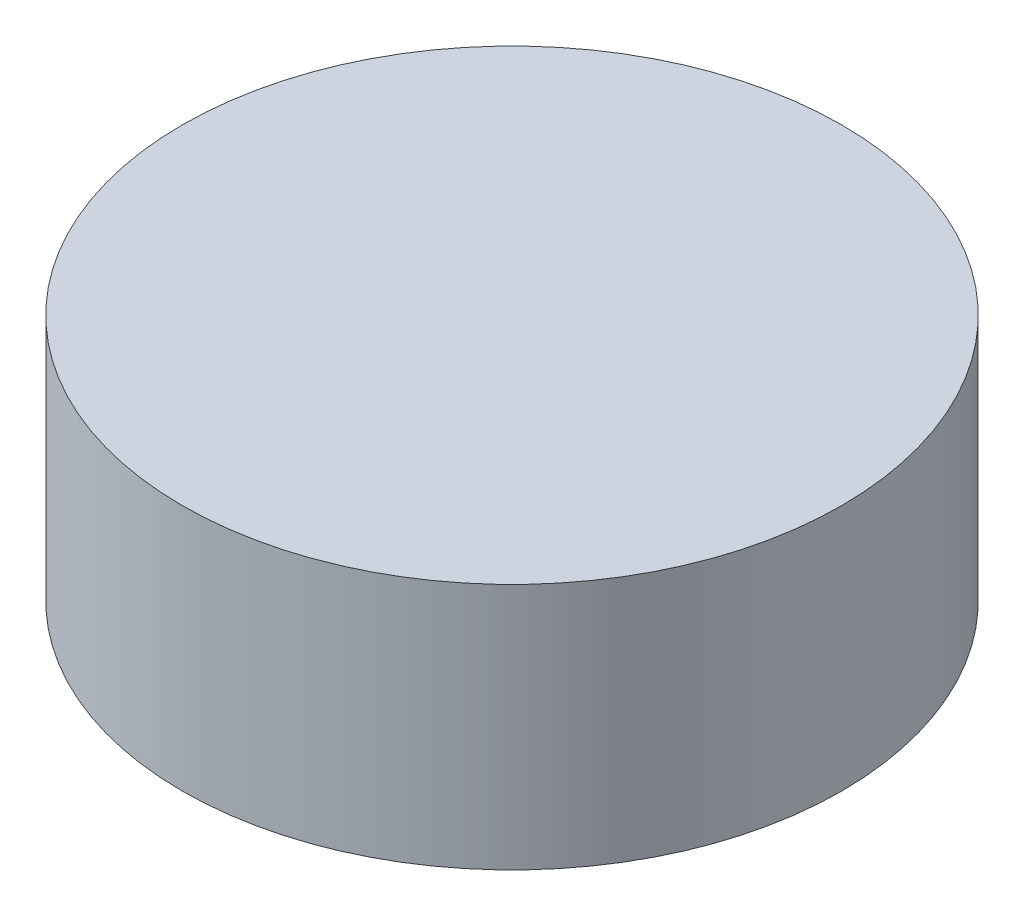
ISO-10303-21;
HEADER;
FILE_DESCRIPTION(('STEP AP214'),'2;1');
FILE_NAME('part.step','',(''),(''),'','','');
FILE_SCHEMA(('AUTOMOTIVE_DESIGN { 1 0 10303 214 1 1 1 1 }'));
ENDSEC;
DATA;
#1=APPLICATION_CONTEXT('core data for automotive mechanical design processes');
#2=APPLICATION_PROTOCOL_DEFINITION('international standard','automotive_design',2000,#1);
#3=PRODUCT_CONTEXT('',#1,'mechanical');
#4=PRODUCT('Part','Part','',(#3));
#5=PRODUCT_RELATED_PRODUCT_CATEGORY('part','',(#4));
#6=PRODUCT_DEFINITION_FORMATION('','',#4);
#7=PRODUCT_DEFINITION_CONTEXT('part definition',#1,'design');
#8=PRODUCT_DEFINITION('design','',#6,#7);
#9=PRODUCT_DEFINITION_SHAPE('','',#8);
#10=(LENGTH_UNIT() NAMED_UNIT(*) SI_UNIT(.MILLI.,.METRE.));
#11=(NAMED_UNIT(*) PLANE_ANGLE_UNIT() SI_UNIT($,.RADIAN.));
#12=(NAMED_UNIT(*) SI_UNIT($,.STERADIAN.) SOLID_ANGLE_UNIT());
#13=UNCERTAINTY_MEASURE_WITH_UNIT(LENGTH_MEASURE(1.E-05),#10,'distance_accuracy_value','');
#14=(GEOMETRIC_REPRESENTATION_CONTEXT(3) GLOBAL_UNCERTAINTY_ASSIGNED_CONTEXT((#13)) GLOBAL_UNIT_ASSIGNED_CONTEXT((#10,
#11,#12)) REPRESENTATION_CONTEXT('',''));
#15=CARTESIAN_POINT('',(0.,0.,0.));
#16=DIRECTION('',(0.,0.,1.));
#17=DIRECTION('',(1.,0.,0.));
#18=AXIS2_PLACEMENT_3D('',#15,#16,#17);
#19=CARTESIAN_POINT('',(0.,10.5,0.));
#20=DIRECTION('',(0.,1.,0.));
#21=DIRECTION('',(0.,0.,1.));
#22=AXIS2_PLACEMENT_3D('',#19,#20,#21);
#23=PLANE('',#22);
#24=CARTESIAN_POINT('',(0.,10.5,0.));
#25=DIRECTION('',(0.,1.,0.));
#26=DIRECTION('',(0.,0.,1.));
#27=AXIS2_PLACEMENT_3D('',#24,#25,#26);
#28=CIRCLE('',#27,3.5);
#29=CARTESIAN_POINT('',(-3.33536308297221,10.5,1.06082661389415));
#30=VERTEX_POINT('',#29);
#31=CARTESIAN_POINT('',(-0.751021188233193,10.5,-3.4184743928871));
#32=VERTEX_POINT('',#31);
#33=EDGE_CURVE('E11',#30,#32,#28,.F.);
#34=ORIENTED_EDGE('',*,*,#33,.F.);
#35=DIRECTION('',(-0.865876006893149,0.,0.500258673774653));
#36=VECTOR('',#35,1.);
#37=CARTESIAN_POINT('',(-0.375194005330973,10.5,-0.649407005169833));
#38=LINE('',#37,#36);
#39=CARTESIAN_POINT('',(-12.9135898481907,10.5,6.59463397261033));
#40=VERTEX_POINT('',#39);
#41=EDGE_CURVE('E178',#30,#40,#38,.T.);
#42=ORIENTED_EDGE('',*,*,#41,.T.);
#43=CARTESIAN_POINT('',(0.,10.5,0.));
#44=DIRECTION('',(0.,1.,0.));
#45=DIRECTION('',(0.,0.,1.));
#46=AXIS2_PLACEMENT_3D('',#43,#44,#45);
#47=CIRCLE('',#46,14.5);
#48=CARTESIAN_POINT('',(-0.754325557921085,10.5,-14.4803657741325));
#49=VERTEX_POINT('',#48);
#50=EDGE_CURVE('E218',#49,#40,#47,.T.);
#51=ORIENTED_EDGE('',*,*,#50,.F.);
#52=DIRECTION('',(-0.000298716505756613,0.,-0.999999955384224));
#53=VECTOR('',#52,1.);
#54=CARTESIAN_POINT('',(-0.749999966538305,10.5,0.0002240373793175));
#55=LINE('',#54,#53);
#56=EDGE_CURVE('E308',#32,#49,#55,.T.);
#57=ORIENTED_EDGE('',*,*,#56,.F.);
#58=EDGE_LOOP('',(#34,#42,#51,#57));
#59=FACE_BOUND('',#58,.T.);
#60=ADVANCED_FACE('F41',(#59),#23,.F.);
#61=CARTESIAN_POINT('',(0.,10.5,0.));
#62=DIRECTION('',(0.,-1.,0.));
#63=DIRECTION('',(0.,0.,-1.));
#64=AXIS2_PLACEMENT_3D('',#61,#62,#63);
#65=CIRCLE('',#64,3.5);
#66=CARTESIAN_POINT('',(0.748978744843143,10.5,-3.41892246764579));
#67=VERTEX_POINT('',#66);
#68=CARTESIAN_POINT('',(3.33599626054341,10.5,1.05883376865323));
#69=VERTEX_POINT('',#68);
#70=EDGE_CURVE('E293',#67,#69,#65,.T.);
#71=ORIENTED_EDGE('',*,*,#70,.F.);
#72=DIRECTION('',(-0.000298716505756614,0.,-0.999999955384224));
#73=VECTOR('',#72,1.);
#74=CARTESIAN_POINT('',(0.74999996653803,10.5,-0.000224037379317419));
#75=LINE('',#74,#73);
#76=CARTESIAN_POINT('',(0.745674375155251,10.5,-14.4808138488911));
#77=VERTEX_POINT('',#76);
#78=EDGE_CURVE('E311',#67,#77,#75,.T.);
#79=ORIENTED_EDGE('',*,*,#78,.T.);
#80=CARTESIAN_POINT('',(0.,10.5,0.));
#81=DIRECTION('',(0.,1.,0.));
#82=DIRECTION('',(0.,0.,1.));
#83=AXIS2_PLACEMENT_3D('',#80,#81,#82);
#84=CIRCLE('',#83,14.5);
#85=CARTESIAN_POINT('',(12.91752739545,10.5,6.5869177911827));
#86=VERTEX_POINT('',#85);
#87=EDGE_CURVE('E172',#86,#77,#84,.T.);
#88=ORIENTED_EDGE('',*,*,#87,.F.);
#89=DIRECTION('',(0.866174723398921,0.,0.499741281609597));
#90=VECTOR('',#89,1.);
#91=CARTESIAN_POINT('',(0.374805961207266,10.5,-0.64963104254931));
#92=LINE('',#91,#90);
#93=EDGE_CURVE('E168',#69,#86,#92,.T.);
#94=ORIENTED_EDGE('',*,*,#93,.F.);
#95=EDGE_LOOP('',(#71,#79,#88,#94));
#96=FACE_BOUND('',#95,.T.);
#97=ADVANCED_FACE('F323',(#96),#23,.F.);
#98=CARTESIAN_POINT('',(2.58638433812907,10.5,2.35809585375164));
#99=VERTEX_POINT('',#98);
#100=CARTESIAN_POINT('',(-2.58497507231021,10.5,2.35964062423387));
#101=VERTEX_POINT('',#100);
#102=EDGE_CURVE('E45',#99,#101,#28,.F.);
#103=ORIENTED_EDGE('',*,*,#102,.F.);
#104=DIRECTION('',(0.866174723398937,0.,0.49974128160957));
#105=VECTOR('',#104,1.);
#106=CARTESIAN_POINT('',(-0.374805961207161,10.5,0.649631042549174));
#107=LINE('',#106,#105);
#108=CARTESIAN_POINT('',(12.1679154730358,10.5,7.88617987628081));
#109=VERTEX_POINT('',#108);
#110=EDGE_CURVE('E145',#99,#109,#107,.T.);
#111=ORIENTED_EDGE('',*,*,#110,.T.);
#112=CARTESIAN_POINT('',(0.,10.5,0.));
#113=DIRECTION('',(0.,1.,0.));
#114=DIRECTION('',(0.,0.,1.));
#115=AXIS2_PLACEMENT_3D('',#112,#113,#114);
#116=CIRCLE('',#115,14.5);
#117=CARTESIAN_POINT('',(-12.1632018375289,10.5,7.89344798294977));
#118=VERTEX_POINT('',#117);
#119=EDGE_CURVE('E157',#118,#109,#116,.T.);
#120=ORIENTED_EDGE('',*,*,#119,.F.);
#121=DIRECTION('',(-0.865876006893164,0.,0.500258673774627));
#122=VECTOR('',#121,1.);
#123=CARTESIAN_POINT('',(0.375194005331039,10.5,0.649407005169993));
#124=LINE('',#123,#122);
#125=EDGE_CURVE('E163',#101,#118,#124,.T.);
#126=ORIENTED_EDGE('',*,*,#125,.F.);
#127=EDGE_LOOP('',(#103,#111,#120,#126));
#128=FACE_BOUND('',#127,.T.);
#129=ADVANCED_FACE('F165',(#128),#23,.F.);
#130=CARTESIAN_POINT('',(0.,10.5,0.));
#131=DIRECTION('',(0.,-1.,0.));
#132=DIRECTION('',(0.,0.,-1.));
#133=AXIS2_PLACEMENT_3D('',#130,#131,#132);
#134=CYLINDRICAL_SURFACE('',#133,14.5);
#135=CARTESIAN_POINT('',(0.,0.,0.));
#136=DIRECTION('',(0.,1.,0.));
#137=DIRECTION('',(0.,0.,1.));
#138=AXIS2_PLACEMENT_3D('',#135,#136,#137);
#139=CIRCLE('',#138,14.5);
#140=CARTESIAN_POINT('',(-0.754325557921085,0.,-14.4803657741325));
#141=VERTEX_POINT('',#140);
#142=CARTESIAN_POINT('',(-12.9135898481907,0.,6.59463397261033));
#143=VERTEX_POINT('',#142);
#144=EDGE_CURVE('E181',#141,#143,#139,.T.);
#145=ORIENTED_EDGE('',*,*,#144,.F.);
#146=DIRECTION('',(0.,-1.,0.));
#147=VECTOR('',#146,1.);
#148=CARTESIAN_POINT('',(-0.754325557921085,10.5,-14.4803657741325));
#149=LINE('',#148,#147);
#150=EDGE_CURVE('E116',#49,#141,#149,.T.);
#151=ORIENTED_EDGE('',*,*,#150,.F.);
#152=ORIENTED_EDGE('',*,*,#50,.T.);
#153=DIRECTION('',(0.,-1.,0.));
#154=VECTOR('',#153,1.);
#155=CARTESIAN_POINT('',(-12.9135898481907,10.5,6.59463397261033));
#156=LINE('',#155,#154);
#157=EDGE_CURVE('E111',#40,#143,#156,.T.);
#158=ORIENTED_EDGE('',*,*,#157,.T.);
#159=EDGE_LOOP('',(#145,#151,#152,#158));
#160=FACE_BOUND('',#159,.T.);
#161=ADVANCED_FACE('F43',(#160),#134,.F.);
#162=CARTESIAN_POINT('',(-0.749999966538305,10.5,0.0002240373793175));
#163=DIRECTION('',(-0.999999955384224,0.,0.000298716505756612));
#164=DIRECTION('',(0.000298716505756612,0.,0.999999955384224));
#165=AXIS2_PLACEMENT_3D('',#162,#163,#164);
#166=PLANE('',#165);
#167=DIRECTION('',(-0.000298716505756613,0.,-0.999999955384224));
#168=VECTOR('',#167,1.);
#169=CARTESIAN_POINT('',(-0.749999966538305,0.,0.0002240373793175));
#170=LINE('',#169,#168);
#171=CARTESIAN_POINT('',(-0.751021188233193,0.,-3.4184743928871));
#172=VERTEX_POINT('',#171);
#173=EDGE_CURVE('E185',#172,#141,#170,.T.);
#174=ORIENTED_EDGE('',*,*,#173,.F.);
#175=DIRECTION('',(0.,-1.,0.));
#176=VECTOR('',#175,1.);
#177=CARTESIAN_POINT('',(-0.751021188233193,10.5,-3.4184743928871));
#178=LINE('',#177,#176);
#179=EDGE_CURVE('E245',#32,#172,#178,.T.);
#180=ORIENTED_EDGE('',*,*,#179,.F.);
#181=ORIENTED_EDGE('',*,*,#56,.T.);
#182=ORIENTED_EDGE('',*,*,#150,.T.);
#183=EDGE_LOOP('',(#174,#180,#181,#182));
#184=FACE_BOUND('',#183,.T.);
#185=ADVANCED_FACE('F361',(#184),#166,.T.);
#186=CARTESIAN_POINT('',(0.74999996653803,10.5,-0.000224037379317419));
#187=DIRECTION('',(-0.999999955384224,0.,0.000298716505756614));
#188=DIRECTION('',(0.000298716505756614,0.,0.999999955384224));
#189=AXIS2_PLACEMENT_3D('',#186,#187,#188);
#190=PLANE('',#189);
#191=DIRECTION('',(-0.000298716505756614,0.,-0.999999955384224));
#192=VECTOR('',#191,1.);
#193=CARTESIAN_POINT('',(0.74999996653803,0.,-0.000224037379317419));
#194=LINE('',#193,#192);
#195=CARTESIAN_POINT('',(0.748978744843143,0.,-3.41892246764579));
#196=VERTEX_POINT('',#195);
#197=CARTESIAN_POINT('',(0.745674375155251,0.,-14.4808138488911));
#198=VERTEX_POINT('',#197);
#199=EDGE_CURVE('E190',#196,#198,#194,.T.);
#200=ORIENTED_EDGE('',*,*,#199,.T.);
#201=DIRECTION('',(0.,-1.,0.));
#202=VECTOR('',#201,1.);
#203=CARTESIAN_POINT('',(0.745674375155251,10.5,-14.4808138488911));
#204=LINE('',#203,#202);
#205=EDGE_CURVE('E239',#77,#198,#204,.T.);
#206=ORIENTED_EDGE('',*,*,#205,.F.);
#207=ORIENTED_EDGE('',*,*,#78,.F.);
#208=DIRECTION('',(0.,-1.,0.));
#209=VECTOR('',#208,1.);
#210=CARTESIAN_POINT('',(0.748978744843143,10.5,-3.41892246764579));
#211=LINE('',#210,#209);
#212=EDGE_CURVE('E242',#67,#196,#211,.T.);
#213=ORIENTED_EDGE('',*,*,#212,.T.);
#214=EDGE_LOOP('',(#200,#206,#207,#213));
#215=FACE_BOUND('',#214,.T.);
#216=ADVANCED_FACE('F326',(#215),#190,.F.);
#217=CARTESIAN_POINT('',(0.,10.5,0.));
#218=DIRECTION('',(0.,-1.,0.));
#219=DIRECTION('',(0.,0.,-1.));
#220=AXIS2_PLACEMENT_3D('',#217,#218,#219);
#221=CYLINDRICAL_SURFACE('',#220,14.5);
#222=CARTESIAN_POINT('',(0.,0.,0.));
#223=DIRECTION('',(0.,1.,0.));
#224=DIRECTION('',(0.,0.,1.));
#225=AXIS2_PLACEMENT_3D('',#222,#223,#224);
#226=CIRCLE('',#225,14.5);
#227=CARTESIAN_POINT('',(12.91752739545,0.,6.5869177911827));
#228=VERTEX_POINT('',#227);
#229=EDGE_CURVE('E194',#228,#198,#226,.T.);
#230=ORIENTED_EDGE('',*,*,#229,.F.);
#231=DIRECTION('',(0.,-1.,0.));
#232=VECTOR('',#231,1.);
#233=CARTESIAN_POINT('',(12.91752739545,10.5,6.5869177911827));
#234=LINE('',#233,#232);
#235=EDGE_CURVE('E236',#86,#228,#234,.T.);
#236=ORIENTED_EDGE('',*,*,#235,.F.);
#237=ORIENTED_EDGE('',*,*,#87,.T.);
#238=ORIENTED_EDGE('',*,*,#205,.T.);
#239=EDGE_LOOP('',(#230,#236,#237,#238));
#240=FACE_BOUND('',#239,.T.);
#241=ADVANCED_FACE('F319',(#240),#221,.F.);
#242=CARTESIAN_POINT('',(0.374805961207266,10.5,-0.64963104254931));
#243=DIRECTION('',(0.499741281609597,0.,-0.866174723398921));
#244=DIRECTION('',(-0.866174723398921,0.,-0.499741281609597));
#245=AXIS2_PLACEMENT_3D('',#242,#243,#244);
#246=PLANE('',#245);
#247=DIRECTION('',(0.866174723398921,0.,0.499741281609597));
#248=VECTOR('',#247,1.);
#249=CARTESIAN_POINT('',(0.374805961207266,0.,-0.64963104254931));
#250=LINE('',#249,#248);
#251=CARTESIAN_POINT('',(3.33599626054341,0.,1.05883376865323));
#252=VERTEX_POINT('',#251);
#253=EDGE_CURVE('E198',#252,#228,#250,.T.);
#254=ORIENTED_EDGE('',*,*,#253,.F.);
#255=DIRECTION('',(0.,-1.,0.));
#256=VECTOR('',#255,1.);
#257=CARTESIAN_POINT('',(3.33599626054341,10.5,1.05883376865323));
#258=LINE('',#257,#256);
#259=EDGE_CURVE('E232',#69,#252,#258,.T.);
#260=ORIENTED_EDGE('',*,*,#259,.F.);
#261=ORIENTED_EDGE('',*,*,#93,.T.);
#262=ORIENTED_EDGE('',*,*,#235,.T.);
#263=EDGE_LOOP('',(#254,#260,#261,#262));
#264=FACE_BOUND('',#263,.T.);
#265=ADVANCED_FACE('F334',(#264),#246,.T.);
#266=CARTESIAN_POINT('',(-0.374805961207161,10.5,0.649631042549174));
#267=DIRECTION('',(0.49974128160957,0.,-0.866174723398937));
#268=DIRECTION('',(-0.866174723398937,0.,-0.49974128160957));
#269=AXIS2_PLACEMENT_3D('',#266,#267,#268);
#270=PLANE('',#269);
#271=DIRECTION('',(0.866174723398937,0.,0.49974128160957));
#272=VECTOR('',#271,1.);
#273=CARTESIAN_POINT('',(-0.374805961207161,0.,0.649631042549174));
#274=LINE('',#273,#272);
#275=CARTESIAN_POINT('',(2.58638433812907,0.,2.35809585375164));
#276=VERTEX_POINT('',#275);
#277=CARTESIAN_POINT('',(12.1679154730358,0.,7.88617987628081));
#278=VERTEX_POINT('',#277);
#279=EDGE_CURVE('E148',#276,#278,#274,.T.);
#280=ORIENTED_EDGE('',*,*,#279,.T.);
#281=DIRECTION('',(0.,-1.,0.));
#282=VECTOR('',#281,1.);
#283=CARTESIAN_POINT('',(12.1679154730358,10.5,7.88617987628081));
#284=LINE('',#283,#282);
#285=EDGE_CURVE('E141',#109,#278,#284,.T.);
#286=ORIENTED_EDGE('',*,*,#285,.F.);
#287=ORIENTED_EDGE('',*,*,#110,.F.);
#288=DIRECTION('',(0.,-1.,0.));
#289=VECTOR('',#288,1.);
#290=CARTESIAN_POINT('',(2.58638433812907,10.5,2.35809585375164));
#291=LINE('',#290,#289);
#292=EDGE_CURVE('E153',#99,#276,#291,.T.);
#293=ORIENTED_EDGE('',*,*,#292,.T.);
#294=EDGE_LOOP('',(#280,#286,#287,#293));
#295=FACE_BOUND('',#294,.T.);
#296=ADVANCED_FACE('F143',(#295),#270,.F.);
#297=CARTESIAN_POINT('',(0.,10.5,0.));
#298=DIRECTION('',(0.,-1.,0.));
#299=DIRECTION('',(0.,0.,-1.));
#300=AXIS2_PLACEMENT_3D('',#297,#298,#299);
#301=CYLINDRICAL_SURFACE('',#300,14.5);
#302=CARTESIAN_POINT('',(0.,0.,0.));
#303=DIRECTION('',(0.,1.,0.));
#304=DIRECTION('',(0.,0.,1.));
#305=AXIS2_PLACEMENT_3D('',#302,#303,#304);
#306=CIRCLE('',#305,14.5);
#307=CARTESIAN_POINT('',(-12.1632018375289,0.,7.89344798294977));
#308=VERTEX_POINT('',#307);
#309=EDGE_CURVE('E204',#308,#278,#306,.T.);
#310=ORIENTED_EDGE('',*,*,#309,.F.);
#311=DIRECTION('',(0.,-1.,0.));
#312=VECTOR('',#311,1.);
#313=CARTESIAN_POINT('',(-12.1632018375289,10.5,7.89344798294977));
#314=LINE('',#313,#312);
#315=EDGE_CURVE('E154',#118,#308,#314,.T.);
#316=ORIENTED_EDGE('',*,*,#315,.F.);
#317=ORIENTED_EDGE('',*,*,#119,.T.);
#318=ORIENTED_EDGE('',*,*,#285,.T.);
#319=EDGE_LOOP('',(#310,#316,#317,#318));
#320=FACE_BOUND('',#319,.T.);
#321=ADVANCED_FACE('F158',(#320),#301,.F.);
#322=CARTESIAN_POINT('',(0.375194005331039,10.5,0.649407005169993));
#323=DIRECTION('',(0.500258673774627,0.,0.865876006893164));
#324=DIRECTION('',(0.865876006893164,0.,-0.500258673774627));
#325=AXIS2_PLACEMENT_3D('',#322,#323,#324);
#326=PLANE('',#325);
#327=DIRECTION('',(-0.865876006893164,0.,0.500258673774627));
#328=VECTOR('',#327,1.);
#329=CARTESIAN_POINT('',(0.375194005331039,0.,0.649407005169993));
#330=LINE('',#329,#328);
#331=CARTESIAN_POINT('',(-2.58497507231021,0.,2.35964062423387));
#332=VERTEX_POINT('',#331);
#333=EDGE_CURVE('E207',#332,#308,#330,.T.);
#334=ORIENTED_EDGE('',*,*,#333,.F.);
#335=DIRECTION('',(0.,-1.,0.));
#336=VECTOR('',#335,1.);
#337=CARTESIAN_POINT('',(-2.58497507231021,10.5,2.35964062423387));
#338=LINE('',#337,#336);
#339=EDGE_CURVE('E224',#101,#332,#338,.T.);
#340=ORIENTED_EDGE('',*,*,#339,.F.);
#341=ORIENTED_EDGE('',*,*,#125,.T.);
#342=ORIENTED_EDGE('',*,*,#315,.T.);
#343=EDGE_LOOP('',(#334,#340,#341,#342));
#344=FACE_BOUND('',#343,.T.);
#345=ADVANCED_FACE('F377',(#344),#326,.T.);
#346=CARTESIAN_POINT('',(-0.375194005330973,10.5,-0.649407005169833));
#347=DIRECTION('',(0.500258673774653,0.,0.865876006893149));
#348=DIRECTION('',(0.865876006893149,0.,-0.500258673774653));
#349=AXIS2_PLACEMENT_3D('',#346,#347,#348);
#350=PLANE('',#349);
#351=DIRECTION('',(-0.865876006893149,0.,0.500258673774653));
#352=VECTOR('',#351,1.);
#353=CARTESIAN_POINT('',(-0.375194005330973,0.,-0.649407005169833));
#354=LINE('',#353,#352);
#355=CARTESIAN_POINT('',(-3.33536308297221,0.,1.06082661389415));
#356=VERTEX_POINT('',#355);
#357=EDGE_CURVE('E211',#356,#143,#354,.T.);
#358=ORIENTED_EDGE('',*,*,#357,.T.);
#359=ORIENTED_EDGE('',*,*,#157,.F.);
#360=ORIENTED_EDGE('',*,*,#41,.F.);
#361=DIRECTION('',(0.,-1.,0.));
#362=VECTOR('',#361,1.);
#363=CARTESIAN_POINT('',(-3.33536308297221,10.5,1.06082661389415));
#364=LINE('',#363,#362);
#365=EDGE_CURVE('E221',#30,#356,#364,.T.);
#366=ORIENTED_EDGE('',*,*,#365,.T.);
#367=EDGE_LOOP('',(#358,#359,#360,#366));
#368=FACE_BOUND('',#367,.T.);
#369=ADVANCED_FACE('F373',(#368),#350,.F.);
#370=CARTESIAN_POINT('',(0.,10.5,0.));
#371=DIRECTION('',(0.,-1.,0.));
#372=DIRECTION('',(0.,0.,-1.));
#373=AXIS2_PLACEMENT_3D('',#370,#371,#372);
#374=CYLINDRICAL_SURFACE('',#373,16.);
#375=CARTESIAN_POINT('',(0.,0.,0.));
#376=DIRECTION('',(0.,1.,0.));
#377=DIRECTION('',(0.,0.,1.));
#378=AXIS2_PLACEMENT_3D('',#375,#376,#377);
#379=CIRCLE('',#378,16.);
#380=CARTESIAN_POINT('',(0.,0.,-16.));
#381=VERTEX_POINT('',#380);
#382=EDGE_CURVE('E214',#381,#381,#379,.T.);
#383=CARTESIAN_POINT('',(0.,12.,0.));
#384=DIRECTION('',(0.,1.,0.));
#385=DIRECTION('',(0.,0.,1.));
#386=AXIS2_PLACEMENT_3D('',#383,#384,#385);
#387=CIRCLE('',#386,16.);
#388=CARTESIAN_POINT('',(0.,12.,-16.));
#389=VERTEX_POINT('',#388);
#390=EDGE_CURVE('E186',#389,#389,#387,.T.);
#391=CARTESIAN_POINT('',(0.,0.,-16.));
#392=CARTESIAN_POINT('',(0.,0.125,-16.));
#393=CARTESIAN_POINT('',(0.,0.25,-16.));
#394=CARTESIAN_POINT('',(0.,0.5,-16.));
#395=CARTESIAN_POINT('',(0.,0.625000000000001,-16.));
#396=CARTESIAN_POINT('',(0.,0.875000000000001,-16.));
#397=CARTESIAN_POINT('',(0.,1.,-16.));
#398=CARTESIAN_POINT('',(0.,1.25,-16.));
#399=CARTESIAN_POINT('',(0.,1.375,-16.));
#400=CARTESIAN_POINT('',(0.,1.625,-16.));
#401=CARTESIAN_POINT('',(0.,1.75,-16.));
#402=CARTESIAN_POINT('',(0.,2.,-16.));
#403=CARTESIAN_POINT('',(0.,2.125,-16.));
#404=CARTESIAN_POINT('',(0.,2.375,-16.));
#405=CARTESIAN_POINT('',(0.,2.5,-16.));
#406=CARTESIAN_POINT('',(0.,2.75,-16.));
#407=CARTESIAN_POINT('',(0.,2.875,-16.));
#408=CARTESIAN_POINT('',(0.,3.125,-16.));
#409=CARTESIAN_POINT('',(0.,3.25,-16.));
#410=CARTESIAN_POINT('',(0.,3.5,-16.));
#411=CARTESIAN_POINT('',(0.,3.625,-16.));
#412=CARTESIAN_POINT('',(0.,3.875,-16.));
#413=CARTESIAN_POINT('',(0.,4.,-16.));
#414=CARTESIAN_POINT('',(0.,4.25,-16.));
#415=CARTESIAN_POINT('',(0.,4.375,-16.));
#416=CARTESIAN_POINT('',(0.,4.625,-16.));
#417=CARTESIAN_POINT('',(0.,4.75,-16.));
#418=CARTESIAN_POINT('',(0.,5.,-16.));
#419=CARTESIAN_POINT('',(0.,5.125,-16.));
#420=CARTESIAN_POINT('',(0.,5.375,-16.));
#421=CARTESIAN_POINT('',(0.,5.5,-16.));
#422=CARTESIAN_POINT('',(0.,5.75,-16.));
#423=CARTESIAN_POINT('',(0.,5.875,-16.));
#424=CARTESIAN_POINT('',(0.,6.125,-16.));
#425=CARTESIAN_POINT('',(0.,6.25,-16.));
#426=CARTESIAN_POINT('',(0.,6.5,-16.));
#427=CARTESIAN_POINT('',(0.,6.625,-16.));
#428=CARTESIAN_POINT('',(0.,6.875,-16.));
#429=CARTESIAN_POINT('',(0.,7.,-16.));
#430=CARTESIAN_POINT('',(0.,7.25,-16.));
#431=CARTESIAN_POINT('',(0.,7.375,-16.));
#432=CARTESIAN_POINT('',(0.,7.625,-16.));
#433=CARTESIAN_POINT('',(0.,7.75,-16.));
#434=CARTESIAN_POINT('',(0.,8.,-16.));
#435=CARTESIAN_POINT('',(0.,8.125,-16.));
#436=CARTESIAN_POINT('',(0.,8.375,-16.));
#437=CARTESIAN_POINT('',(0.,8.5,-16.));
#438=CARTESIAN_POINT('',(0.,8.75,-16.));
#439=CARTESIAN_POINT('',(0.,8.875,-16.));
#440=CARTESIAN_POINT('',(0.,9.125,-16.));
#441=CARTESIAN_POINT('',(0.,9.25,-16.));
#442=CARTESIAN_POINT('',(0.,9.5,-16.));
#443=CARTESIAN_POINT('',(0.,9.625,-16.));
#444=CARTESIAN_POINT('',(0.,9.875,-16.));
#445=CARTESIAN_POINT('',(0.,10.,-16.));
#446=CARTESIAN_POINT('',(0.,10.25,-16.));
#447=CARTESIAN_POINT('',(0.,10.375,-16.));
#448=CARTESIAN_POINT('',(0.,10.625,-16.));
#449=CARTESIAN_POINT('',(0.,10.75,-16.));
#450=CARTESIAN_POINT('',(0.,11.,-16.));
#451=CARTESIAN_POINT('',(0.,11.125,-16.));
#452=CARTESIAN_POINT('',(0.,11.375,-16.));
#453=CARTESIAN_POINT('',(0.,11.5,-16.));
#454=CARTESIAN_POINT('',(0.,11.75,-16.));
#455=CARTESIAN_POINT('',(0.,11.875,-16.));
#456=CARTESIAN_POINT('',(0.,12.,-16.));
#457=B_SPLINE_CURVE_WITH_KNOTS('',3,(#391,#392,#393,#394,#395,#396,#397,#398,#399,#400,#401,
#402,#403,#404,#405,#406,#407,#408,#409,#410,#411,#412,#413,#414,#415,#416,#417,#418,#419,#420,
#421,#422,#423,#424,#425,#426,#427,#428,#429,#430,#431,#432,#433,#434,#435,#436,#437,#438,#439,
#440,#441,#442,#443,#444,#445,#446,#447,#448,#449,#450,#451,#452,#453,#454,#455,#456),
.UNSPECIFIED.,.F.,.F.,(4,2,2,2,2,2,2,2,2,2,2,2,2,2,2,2,2,2,2,2,2,2,2,2,2,2,2,2,2,2,2,2,4),(0.,
0.375,0.750000000000001,1.125,1.5,1.875,2.25,2.625,3.,3.375,3.75,4.125,4.5,4.875,5.25,5.625,6.,
6.375,6.75,7.125,7.5,7.875,8.25,8.625,9.,9.375,9.75,10.125,10.5,10.875,11.25,11.625,12.),.UNSPECIFIED.);
#458=EDGE_CURVE('BSEAM376',#381,#389,#457,.T.);
#459=ORIENTED_EDGE('',*,*,#382,.T.);
#460=ORIENTED_EDGE('',*,*,#390,.F.);
#461=ORIENTED_EDGE('',*,*,#458,.T.);
#462=ORIENTED_EDGE('',*,*,#458,.F.);
#463=EDGE_LOOP('',(#459,#461,#460,#462));
#464=FACE_BOUND('',#463,.T.);
#465=ADVANCED_FACE('F376',(#464),#374,.T.);
#466=CARTESIAN_POINT('',(0.,0.,0.));
#467=DIRECTION('',(0.,1.,0.));
#468=DIRECTION('',(0.,0.,1.));
#469=AXIS2_PLACEMENT_3D('',#466,#467,#468);
#470=PLANE('',#469);
#471=CARTESIAN_POINT('',(0.,0.,0.));
#472=DIRECTION('',(0.,-1.,0.));
#473=DIRECTION('',(0.,0.,-1.));
#474=AXIS2_PLACEMENT_3D('',#471,#472,#473);
#475=CIRCLE('',#474,3.5);
#476=EDGE_CURVE('E298',#276,#332,#475,.T.);
#477=ORIENTED_EDGE('',*,*,#476,.T.);
#478=ORIENTED_EDGE('',*,*,#333,.T.);
#479=ORIENTED_EDGE('',*,*,#309,.T.);
#480=ORIENTED_EDGE('',*,*,#279,.F.);
#481=EDGE_LOOP('',(#477,#478,#479,#480));
#482=FACE_BOUND('',#481,.T.);
#483=EDGE_CURVE('E299',#356,#172,#475,.T.);
#484=ORIENTED_EDGE('',*,*,#483,.T.);
#485=ORIENTED_EDGE('',*,*,#173,.T.);
#486=ORIENTED_EDGE('',*,*,#144,.T.);
#487=ORIENTED_EDGE('',*,*,#357,.F.);
#488=EDGE_LOOP('',(#484,#485,#486,#487));
#489=FACE_BOUND('',#488,.T.);
#490=ORIENTED_EDGE('',*,*,#199,.F.);
#491=EDGE_CURVE('E294',#196,#252,#475,.T.);
#492=ORIENTED_EDGE('',*,*,#491,.T.);
#493=ORIENTED_EDGE('',*,*,#253,.T.);
#494=ORIENTED_EDGE('',*,*,#229,.T.);
#495=EDGE_LOOP('',(#490,#492,#493,#494));
#496=FACE_BOUND('',#495,.T.);
#497=ORIENTED_EDGE('',*,*,#382,.F.);
#498=EDGE_LOOP('',(#497));
#499=FACE_BOUND('',#498,.T.);
#500=DIRECTION('',(1.,0.,0.));
#501=VECTOR('',#500,1.);
#502=CARTESIAN_POINT('',(-2.59807621135332,0.,-1.5));
#503=LINE('',#502,#501);
#504=CARTESIAN_POINT('',(-2.59807621135332,0.,-1.5));
#505=VERTEX_POINT('',#504);
#506=CARTESIAN_POINT('',(2.59807621135332,0.,-1.5));
#507=VERTEX_POINT('',#506);
#508=EDGE_CURVE('E265',#505,#507,#503,.T.);
#509=ORIENTED_EDGE('',*,*,#508,.F.);
#510=CARTESIAN_POINT('',(0.,0.,0.));
#511=DIRECTION('',(0.,-1.,0.));
#512=DIRECTION('',(0.,0.,-1.));
#513=AXIS2_PLACEMENT_3D('',#510,#511,#512);
#514=CIRCLE('',#513,3.);
#515=EDGE_CURVE('E273',#507,#505,#514,.T.);
#516=ORIENTED_EDGE('',*,*,#515,.F.);
#517=EDGE_LOOP('',(#509,#516));
#518=FACE_BOUND('',#517,.T.);
#519=ADVANCED_FACE('F282',(#482,#489,#496,#499,#518),#470,.F.);
#520=CARTESIAN_POINT('',(0.,12.,0.));
#521=DIRECTION('',(0.,1.,0.));
#522=DIRECTION('',(0.,0.,1.));
#523=AXIS2_PLACEMENT_3D('',#520,#521,#522);
#524=PLANE('',#523);
#525=ORIENTED_EDGE('',*,*,#390,.T.);
#526=EDGE_LOOP('',(#525));
#527=FACE_BOUND('',#526,.T.);
#528=ADVANCED_FACE('F415',(#527),#524,.T.);
#529=CARTESIAN_POINT('',(0.,0.,0.));
#530=DIRECTION('',(0.,1.,0.));
#531=DIRECTION('',(0.,0.,1.));
#532=AXIS2_PLACEMENT_3D('',#529,#530,#531);
#533=CYLINDRICAL_SURFACE('',#532,3.5);
#534=ORIENTED_EDGE('',*,*,#491,.F.);
#535=ORIENTED_EDGE('',*,*,#212,.F.);
#536=ORIENTED_EDGE('',*,*,#70,.T.);
#537=ORIENTED_EDGE('',*,*,#259,.T.);
#538=EDGE_LOOP('',(#534,#535,#536,#537));
#539=FACE_BOUND('',#538,.T.);
#540=ADVANCED_FACE('F330',(#539),#533,.T.);
#541=ORIENTED_EDGE('',*,*,#476,.F.);
#542=ORIENTED_EDGE('',*,*,#292,.F.);
#543=ORIENTED_EDGE('',*,*,#102,.T.);
#544=ORIENTED_EDGE('',*,*,#339,.T.);
#545=EDGE_LOOP('',(#541,#542,#543,#544));
#546=FACE_BOUND('',#545,.T.);
#547=ADVANCED_FACE('F254',(#546),#533,.T.);
#548=ORIENTED_EDGE('',*,*,#179,.T.);
#549=ORIENTED_EDGE('',*,*,#483,.F.);
#550=ORIENTED_EDGE('',*,*,#365,.F.);
#551=ORIENTED_EDGE('',*,*,#33,.T.);
#552=EDGE_LOOP('',(#548,#549,#550,#551));
#553=FACE_BOUND('',#552,.T.);
#554=ADVANCED_FACE('F370',(#553),#533,.T.);
#555=CARTESIAN_POINT('',(0.,0.,0.));
#556=DIRECTION('',(0.,1.,0.));
#557=DIRECTION('',(0.,0.,1.));
#558=AXIS2_PLACEMENT_3D('',#555,#556,#557);
#559=CYLINDRICAL_SURFACE('',#558,3.);
#560=CARTESIAN_POINT('',(0.,10.5,0.));
#561=DIRECTION('',(0.,-1.,0.));
#562=DIRECTION('',(0.,0.,-1.));
#563=AXIS2_PLACEMENT_3D('',#560,#561,#562);
#564=CIRCLE('',#563,3.);
#565=CARTESIAN_POINT('',(2.59807621135332,10.5,-1.5));
#566=VERTEX_POINT('',#565);
#567=CARTESIAN_POINT('',(-2.59807621135332,10.5,-1.5));
#568=VERTEX_POINT('',#567);
#569=EDGE_CURVE('E278',#566,#568,#564,.T.);
#570=ORIENTED_EDGE('',*,*,#569,.F.);
#571=DIRECTION('',(0.,1.,0.));
#572=VECTOR('',#571,1.);
#573=CARTESIAN_POINT('',(2.59807621135332,0.,-1.5));
#574=LINE('',#573,#572);
#575=EDGE_CURVE('E57',#507,#566,#574,.T.);
#576=ORIENTED_EDGE('',*,*,#575,.F.);
#577=ORIENTED_EDGE('',*,*,#515,.T.);
#578=DIRECTION('',(0.,1.,0.));
#579=VECTOR('',#578,1.);
#580=CARTESIAN_POINT('',(-2.59807621135332,0.,-1.5));
#581=LINE('',#580,#579);
#582=EDGE_CURVE('E268',#505,#568,#581,.T.);
#583=ORIENTED_EDGE('',*,*,#582,.T.);
#584=EDGE_LOOP('',(#570,#576,#577,#583));
#585=FACE_BOUND('',#584,.T.);
#586=ADVANCED_FACE('F276',(#585),#559,.F.);
#587=CARTESIAN_POINT('',(-2.59807621135332,0.,-1.5));
#588=DIRECTION('',(0.,0.,1.));
#589=DIRECTION('',(1.,0.,0.));
#590=AXIS2_PLACEMENT_3D('',#587,#588,#589);
#591=PLANE('',#590);
#592=DIRECTION('',(1.,0.,0.));
#593=VECTOR('',#592,1.);
#594=CARTESIAN_POINT('',(-2.59807621135332,10.5,-1.5));
#595=LINE('',#594,#593);
#596=EDGE_CURVE('E284',#568,#566,#595,.T.);
#597=ORIENTED_EDGE('',*,*,#596,.F.);
#598=ORIENTED_EDGE('',*,*,#582,.F.);
#599=ORIENTED_EDGE('',*,*,#508,.T.);
#600=ORIENTED_EDGE('',*,*,#575,.T.);
#601=EDGE_LOOP('',(#597,#598,#599,#600));
#602=FACE_BOUND('',#601,.T.);
#603=ADVANCED_FACE('F266',(#602),#591,.T.);
#604=ORIENTED_EDGE('',*,*,#596,.T.);
#605=ORIENTED_EDGE('',*,*,#569,.T.);
#606=EDGE_LOOP('',(#604,#605));
#607=FACE_BOUND('',#606,.T.);
#608=ADVANCED_FACE('F345',(#607),#23,.F.);
#609=CLOSED_SHELL('',(#60,#97,#129,#161,#185,#216,#241,#265,#296,#321,#345,#369,#465,#519,#528,
#540,#547,#554,#586,#603,#608));
#610=MANIFOLD_SOLID_BREP('B2',#609);
#611=ADVANCED_BREP_SHAPE_REPRESENTATION('',(#18,#610),#14);
#612=SHAPE_DEFINITION_REPRESENTATION(#9,#611);
ENDSEC;
END-ISO-10303-21;
